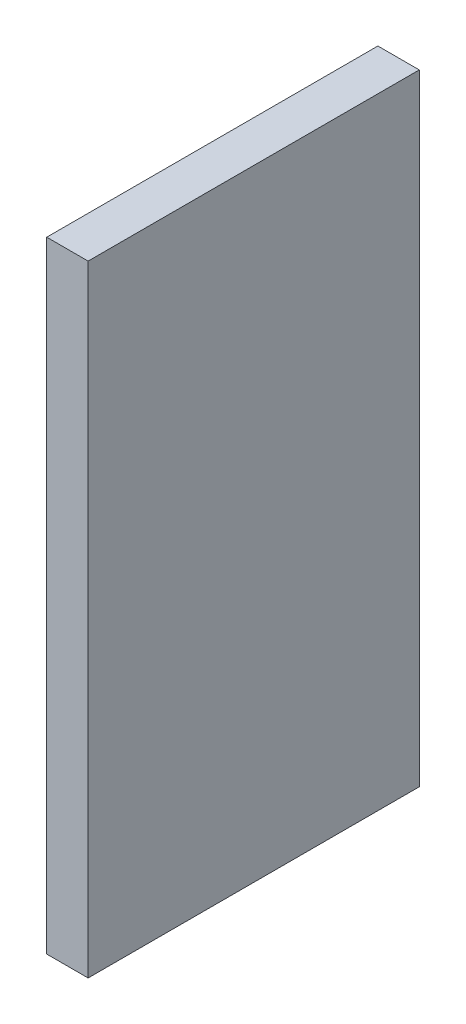
ISO-10303-21;
HEADER;
FILE_DESCRIPTION(('STEP AP214'),'2;1');
FILE_NAME('part.step','',(''),(''),'','','');
FILE_SCHEMA(('AUTOMOTIVE_DESIGN { 1 0 10303 214 1 1 1 1 }'));
ENDSEC;
DATA;
#1=APPLICATION_CONTEXT('core data for automotive mechanical design processes');
#2=APPLICATION_PROTOCOL_DEFINITION('international standard','automotive_design',2000,#1);
#3=PRODUCT_CONTEXT('',#1,'mechanical');
#4=PRODUCT('Part','Part','',(#3));
#5=PRODUCT_RELATED_PRODUCT_CATEGORY('part','',(#4));
#6=PRODUCT_DEFINITION_FORMATION('','',#4);
#7=PRODUCT_DEFINITION_CONTEXT('part definition',#1,'design');
#8=PRODUCT_DEFINITION('design','',#6,#7);
#9=PRODUCT_DEFINITION_SHAPE('','',#8);
#10=(LENGTH_UNIT() NAMED_UNIT(*) SI_UNIT(.MILLI.,.METRE.));
#11=(NAMED_UNIT(*) PLANE_ANGLE_UNIT() SI_UNIT($,.RADIAN.));
#12=(NAMED_UNIT(*) SI_UNIT($,.STERADIAN.) SOLID_ANGLE_UNIT());
#13=UNCERTAINTY_MEASURE_WITH_UNIT(LENGTH_MEASURE(1.E-05),#10,'distance_accuracy_value','');
#14=(GEOMETRIC_REPRESENTATION_CONTEXT(3) GLOBAL_UNCERTAINTY_ASSIGNED_CONTEXT((#13)) GLOBAL_UNIT_ASSIGNED_CONTEXT((#10,
#11,#12)) REPRESENTATION_CONTEXT('',''));
#15=CARTESIAN_POINT('',(0.,0.,0.));
#16=DIRECTION('',(0.,0.,1.));
#17=DIRECTION('',(1.,0.,0.));
#18=AXIS2_PLACEMENT_3D('',#15,#16,#17);
#19=CARTESIAN_POINT('',(2.5,10.3070500330657,-8.00000000000001));
#20=DIRECTION('',(1.,0.,0.));
#21=DIRECTION('',(0.,1.,0.));
#22=AXIS2_PLACEMENT_3D('',#19,#20,#21);
#23=PLANE('',#22);
#24=DIRECTION('',(0.,1.,0.));
#25=VECTOR('',#24,1.);
#26=CARTESIAN_POINT('',(2.5,10.3070500330657,0.));
#27=LINE('',#26,#25);
#28=CARTESIAN_POINT('',(2.5,10.3070500330657,0.));
#29=VERTEX_POINT('',#28);
#30=CARTESIAN_POINT('',(2.5,25.3070500330657,0.));
#31=VERTEX_POINT('',#30);
#32=EDGE_CURVE('E92',#29,#31,#27,.T.);
#33=ORIENTED_EDGE('',*,*,#32,.F.);
#34=DIRECTION('',(0.,0.,1.));
#35=VECTOR('',#34,1.);
#36=CARTESIAN_POINT('',(2.5,10.3070500330657,-8.00000000000001));
#37=LINE('',#36,#35);
#38=CARTESIAN_POINT('',(2.5,10.3070500330657,-8.00000000000001));
#39=VERTEX_POINT('',#38);
#40=EDGE_CURVE('E11',#39,#29,#37,.T.);
#41=ORIENTED_EDGE('',*,*,#40,.F.);
#42=DIRECTION('',(0.,1.,0.));
#43=VECTOR('',#42,1.);
#44=CARTESIAN_POINT('',(2.5,10.3070500330657,-8.00000000000001));
#45=LINE('',#44,#43);
#46=CARTESIAN_POINT('',(2.5,25.3070500330657,-8.00000000000001));
#47=VERTEX_POINT('',#46);
#48=EDGE_CURVE('E86',#39,#47,#45,.T.);
#49=ORIENTED_EDGE('',*,*,#48,.T.);
#50=DIRECTION('',(0.,0.,1.));
#51=VECTOR('',#50,1.);
#52=CARTESIAN_POINT('',(2.5,25.3070500330657,-8.00000000000001));
#53=LINE('',#52,#51);
#54=EDGE_CURVE('E31',#47,#31,#53,.T.);
#55=ORIENTED_EDGE('',*,*,#54,.T.);
#56=EDGE_LOOP('',(#33,#41,#49,#55));
#57=FACE_BOUND('',#56,.T.);
#58=ADVANCED_FACE('F28',(#57),#23,.T.);
#59=CARTESIAN_POINT('',(2.5,10.3070500330657,-8.00000000000001));
#60=DIRECTION('',(0.,-1.,0.));
#61=DIRECTION('',(1.,0.,0.));
#62=AXIS2_PLACEMENT_3D('',#59,#60,#61);
#63=PLANE('',#62);
#64=DIRECTION('',(1.,0.,0.));
#65=VECTOR('',#64,1.);
#66=CARTESIAN_POINT('',(2.5,10.3070500330657,0.));
#67=LINE('',#66,#65);
#68=CARTESIAN_POINT('',(1.5,10.3070500330657,0.));
#69=VERTEX_POINT('',#68);
#70=EDGE_CURVE('E88',#69,#29,#67,.T.);
#71=ORIENTED_EDGE('',*,*,#70,.F.);
#72=DIRECTION('',(0.,0.,1.));
#73=VECTOR('',#72,1.);
#74=CARTESIAN_POINT('',(1.5,10.3070500330657,-8.00000000000001));
#75=LINE('',#74,#73);
#76=CARTESIAN_POINT('',(1.5,10.3070500330657,-8.00000000000001));
#77=VERTEX_POINT('',#76);
#78=EDGE_CURVE('E37',#77,#69,#75,.T.);
#79=ORIENTED_EDGE('',*,*,#78,.F.);
#80=DIRECTION('',(1.,0.,0.));
#81=VECTOR('',#80,1.);
#82=CARTESIAN_POINT('',(2.5,10.3070500330657,-8.00000000000001));
#83=LINE('',#82,#81);
#84=EDGE_CURVE('E83',#77,#39,#83,.T.);
#85=ORIENTED_EDGE('',*,*,#84,.T.);
#86=ORIENTED_EDGE('',*,*,#40,.T.);
#87=EDGE_LOOP('',(#71,#79,#85,#86));
#88=FACE_BOUND('',#87,.T.);
#89=ADVANCED_FACE('F102',(#88),#63,.T.);
#90=CARTESIAN_POINT('',(1.5,25.3070500330657,-8.00000000000001));
#91=DIRECTION('',(-1.,0.,0.));
#92=DIRECTION('',(0.,0.,1.));
#93=AXIS2_PLACEMENT_3D('',#90,#91,#92);
#94=PLANE('',#93);
#95=DIRECTION('',(0.,-1.,0.));
#96=VECTOR('',#95,1.);
#97=CARTESIAN_POINT('',(1.5,25.3070500330657,0.));
#98=LINE('',#97,#96);
#99=CARTESIAN_POINT('',(1.5,25.3070500330657,0.));
#100=VERTEX_POINT('',#99);
#101=EDGE_CURVE('E78',#100,#69,#98,.T.);
#102=ORIENTED_EDGE('',*,*,#101,.F.);
#103=DIRECTION('',(0.,0.,1.));
#104=VECTOR('',#103,1.);
#105=CARTESIAN_POINT('',(1.5,25.3070500330657,-8.00000000000001));
#106=LINE('',#105,#104);
#107=CARTESIAN_POINT('',(1.5,25.3070500330657,-8.00000000000001));
#108=VERTEX_POINT('',#107);
#109=EDGE_CURVE('E73',#108,#100,#106,.T.);
#110=ORIENTED_EDGE('',*,*,#109,.F.);
#111=DIRECTION('',(0.,-1.,0.));
#112=VECTOR('',#111,1.);
#113=CARTESIAN_POINT('',(1.5,25.3070500330657,-8.00000000000001));
#114=LINE('',#113,#112);
#115=EDGE_CURVE('E76',#108,#77,#114,.T.);
#116=ORIENTED_EDGE('',*,*,#115,.T.);
#117=ORIENTED_EDGE('',*,*,#78,.T.);
#118=EDGE_LOOP('',(#102,#110,#116,#117));
#119=FACE_BOUND('',#118,.T.);
#120=ADVANCED_FACE('F75',(#119),#94,.T.);
#121=CARTESIAN_POINT('',(2.5,25.3070500330657,-8.00000000000001));
#122=DIRECTION('',(0.,1.,0.));
#123=DIRECTION('',(-1.,0.,0.));
#124=AXIS2_PLACEMENT_3D('',#121,#122,#123);
#125=PLANE('',#124);
#126=DIRECTION('',(-1.,0.,0.));
#127=VECTOR('',#126,1.);
#128=CARTESIAN_POINT('',(2.5,25.3070500330657,0.));
#129=LINE('',#128,#127);
#130=EDGE_CURVE('E95',#31,#100,#129,.T.);
#131=ORIENTED_EDGE('',*,*,#130,.F.);
#132=ORIENTED_EDGE('',*,*,#54,.F.);
#133=DIRECTION('',(-1.,0.,0.));
#134=VECTOR('',#133,1.);
#135=CARTESIAN_POINT('',(2.5,25.3070500330657,-8.00000000000001));
#136=LINE('',#135,#134);
#137=EDGE_CURVE('E82',#47,#108,#136,.T.);
#138=ORIENTED_EDGE('',*,*,#137,.T.);
#139=ORIENTED_EDGE('',*,*,#109,.T.);
#140=EDGE_LOOP('',(#131,#132,#138,#139));
#141=FACE_BOUND('',#140,.T.);
#142=ADVANCED_FACE('F85',(#141),#125,.T.);
#143=CARTESIAN_POINT('',(2.5,10.3070500330657,-8.00000000000001));
#144=DIRECTION('',(0.,0.,1.));
#145=DIRECTION('',(1.,0.,0.));
#146=AXIS2_PLACEMENT_3D('',#143,#144,#145);
#147=PLANE('',#146);
#148=ORIENTED_EDGE('',*,*,#48,.F.);
#149=ORIENTED_EDGE('',*,*,#84,.F.);
#150=ORIENTED_EDGE('',*,*,#115,.F.);
#151=ORIENTED_EDGE('',*,*,#137,.F.);
#152=EDGE_LOOP('',(#148,#149,#150,#151));
#153=FACE_BOUND('',#152,.T.);
#154=ADVANCED_FACE('F81',(#153),#147,.F.);
#155=CARTESIAN_POINT('',(2.5,10.3070500330657,0.));
#156=DIRECTION('',(0.,0.,1.));
#157=DIRECTION('',(1.,0.,0.));
#158=AXIS2_PLACEMENT_3D('',#155,#156,#157);
#159=PLANE('',#158);
#160=ORIENTED_EDGE('',*,*,#32,.T.);
#161=ORIENTED_EDGE('',*,*,#130,.T.);
#162=ORIENTED_EDGE('',*,*,#101,.T.);
#163=ORIENTED_EDGE('',*,*,#70,.T.);
#164=EDGE_LOOP('',(#160,#161,#162,#163));
#165=FACE_BOUND('',#164,.T.);
#166=ADVANCED_FACE('F101',(#165),#159,.T.);
#167=CLOSED_SHELL('',(#58,#89,#120,#142,#154,#166));
#168=MANIFOLD_SOLID_BREP('B2',#167);
#169=ADVANCED_BREP_SHAPE_REPRESENTATION('',(#18,#168),#14);
#170=SHAPE_DEFINITION_REPRESENTATION(#9,#169);
ENDSEC;
END-ISO-10303-21;
